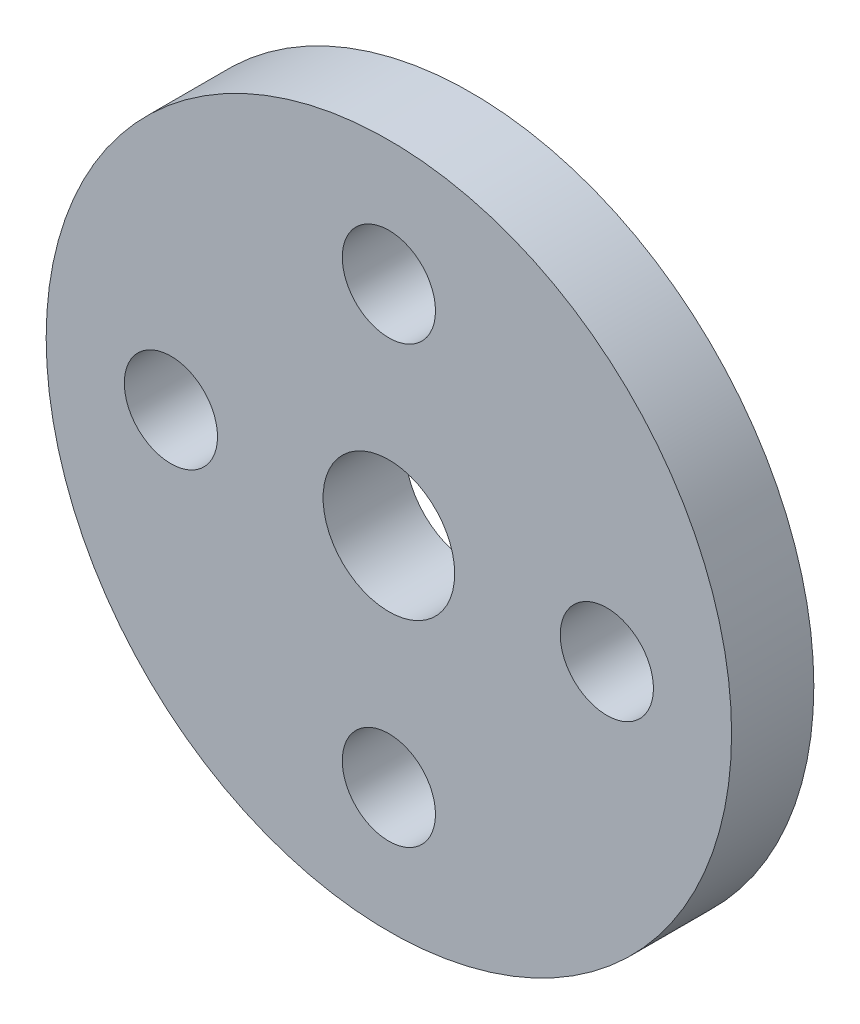
ISO-10303-21;
HEADER;
FILE_DESCRIPTION(('STEP AP214'),'2;1');
FILE_NAME('part.step','',(''),(''),'','','');
FILE_SCHEMA(('AUTOMOTIVE_DESIGN { 1 0 10303 214 1 1 1 1 }'));
ENDSEC;
DATA;
#1=APPLICATION_CONTEXT('core data for automotive mechanical design processes');
#2=APPLICATION_PROTOCOL_DEFINITION('international standard','automotive_design',2000,#1);
#3=PRODUCT_CONTEXT('',#1,'mechanical');
#4=PRODUCT('Part','Part','',(#3));
#5=PRODUCT_RELATED_PRODUCT_CATEGORY('part','',(#4));
#6=PRODUCT_DEFINITION_FORMATION('','',#4);
#7=PRODUCT_DEFINITION_CONTEXT('part definition',#1,'design');
#8=PRODUCT_DEFINITION('design','',#6,#7);
#9=PRODUCT_DEFINITION_SHAPE('','',#8);
#10=(LENGTH_UNIT() NAMED_UNIT(*) SI_UNIT(.MILLI.,.METRE.));
#11=(NAMED_UNIT(*) PLANE_ANGLE_UNIT() SI_UNIT($,.RADIAN.));
#12=(NAMED_UNIT(*) SI_UNIT($,.STERADIAN.) SOLID_ANGLE_UNIT());
#13=UNCERTAINTY_MEASURE_WITH_UNIT(LENGTH_MEASURE(1.E-05),#10,'distance_accuracy_value','');
#14=(GEOMETRIC_REPRESENTATION_CONTEXT(3) GLOBAL_UNCERTAINTY_ASSIGNED_CONTEXT((#13)) GLOBAL_UNIT_ASSIGNED_CONTEXT((#10,
#11,#12)) REPRESENTATION_CONTEXT('',''));
#15=CARTESIAN_POINT('',(0.,0.,0.));
#16=DIRECTION('',(0.,0.,1.));
#17=DIRECTION('',(1.,0.,0.));
#18=AXIS2_PLACEMENT_3D('',#15,#16,#17);
#19=CARTESIAN_POINT('',(0.,0.,3.));
#20=DIRECTION('',(0.,0.,1.));
#21=DIRECTION('',(1.,0.,0.));
#22=AXIS2_PLACEMENT_3D('',#19,#20,#21);
#23=PLANE('',#22);
#24=CARTESIAN_POINT('',(0.,-7.95,3.));
#25=DIRECTION('',(0.,0.,1.));
#26=DIRECTION('',(1.,0.,0.));
#27=AXIS2_PLACEMENT_3D('',#24,#25,#26);
#28=CIRCLE('',#27,1.69999999999999);
#29=CARTESIAN_POINT('',(1.69999999999999,-7.95,3.));
#30=VERTEX_POINT('',#29);
#31=EDGE_CURVE('E57',#30,#30,#28,.T.);
#32=ORIENTED_EDGE('',*,*,#31,.F.);
#33=EDGE_LOOP('',(#32));
#34=FACE_BOUND('',#33,.T.);
#35=CARTESIAN_POINT('',(0.,7.95,3.));
#36=DIRECTION('',(0.,0.,1.));
#37=DIRECTION('',(1.,0.,0.));
#38=AXIS2_PLACEMENT_3D('',#35,#36,#37);
#39=CIRCLE('',#38,1.69999999999999);
#40=CARTESIAN_POINT('',(1.69999999999999,7.95,3.));
#41=VERTEX_POINT('',#40);
#42=EDGE_CURVE('E45',#41,#41,#39,.T.);
#43=ORIENTED_EDGE('',*,*,#42,.F.);
#44=EDGE_LOOP('',(#43));
#45=FACE_BOUND('',#44,.T.);
#46=CARTESIAN_POINT('',(0.,0.,3.));
#47=DIRECTION('',(0.,0.,1.));
#48=DIRECTION('',(1.,0.,0.));
#49=AXIS2_PLACEMENT_3D('',#46,#47,#48);
#50=CIRCLE('',#49,12.5);
#51=CARTESIAN_POINT('',(12.5,0.,3.));
#52=VERTEX_POINT('',#51);
#53=EDGE_CURVE('E10',#52,#52,#50,.T.);
#54=ORIENTED_EDGE('',*,*,#53,.T.);
#55=EDGE_LOOP('',(#54));
#56=FACE_BOUND('',#55,.T.);
#57=CARTESIAN_POINT('',(0.,0.,3.));
#58=DIRECTION('',(0.,0.,1.));
#59=DIRECTION('',(1.,0.,0.));
#60=AXIS2_PLACEMENT_3D('',#57,#58,#59);
#61=CIRCLE('',#60,2.4);
#62=CARTESIAN_POINT('',(2.4,0.,3.));
#63=VERTEX_POINT('',#62);
#64=EDGE_CURVE('E40',#63,#63,#61,.T.);
#65=ORIENTED_EDGE('',*,*,#64,.F.);
#66=EDGE_LOOP('',(#65));
#67=FACE_BOUND('',#66,.T.);
#68=CARTESIAN_POINT('',(7.95,0.,3.));
#69=DIRECTION('',(0.,0.,1.));
#70=DIRECTION('',(1.,0.,0.));
#71=AXIS2_PLACEMENT_3D('',#68,#69,#70);
#72=CIRCLE('',#71,1.69999999999999);
#73=CARTESIAN_POINT('',(9.64999999999999,0.,3.));
#74=VERTEX_POINT('',#73);
#75=EDGE_CURVE('E51',#74,#74,#72,.T.);
#76=ORIENTED_EDGE('',*,*,#75,.F.);
#77=EDGE_LOOP('',(#76));
#78=FACE_BOUND('',#77,.T.);
#79=CARTESIAN_POINT('',(-7.95,0.,3.));
#80=DIRECTION('',(0.,0.,1.));
#81=DIRECTION('',(1.,0.,0.));
#82=AXIS2_PLACEMENT_3D('',#79,#80,#81);
#83=CIRCLE('',#82,1.69999999999999);
#84=CARTESIAN_POINT('',(-6.25000000000001,0.,3.));
#85=VERTEX_POINT('',#84);
#86=EDGE_CURVE('E63',#85,#85,#83,.T.);
#87=ORIENTED_EDGE('',*,*,#86,.F.);
#88=EDGE_LOOP('',(#87));
#89=FACE_BOUND('',#88,.T.);
#90=ADVANCED_FACE('F29',(#34,#45,#56,#67,#78,#89),#23,.T.);
#91=CARTESIAN_POINT('',(0.,0.,0.));
#92=DIRECTION('',(0.,0.,1.));
#93=DIRECTION('',(1.,0.,0.));
#94=AXIS2_PLACEMENT_3D('',#91,#92,#93);
#95=PLANE('',#94);
#96=CARTESIAN_POINT('',(0.,-7.95,0.));
#97=DIRECTION('',(0.,0.,1.));
#98=DIRECTION('',(1.,0.,0.));
#99=AXIS2_PLACEMENT_3D('',#96,#97,#98);
#100=CIRCLE('',#99,1.69999999999999);
#101=CARTESIAN_POINT('',(1.69999999999999,-7.95,0.));
#102=VERTEX_POINT('',#101);
#103=EDGE_CURVE('E60',#102,#102,#100,.T.);
#104=ORIENTED_EDGE('',*,*,#103,.T.);
#105=EDGE_LOOP('',(#104));
#106=FACE_BOUND('',#105,.T.);
#107=CARTESIAN_POINT('',(0.,7.95,0.));
#108=DIRECTION('',(0.,0.,1.));
#109=DIRECTION('',(1.,0.,0.));
#110=AXIS2_PLACEMENT_3D('',#107,#108,#109);
#111=CIRCLE('',#110,1.69999999999999);
#112=CARTESIAN_POINT('',(1.69999999999999,7.95,0.));
#113=VERTEX_POINT('',#112);
#114=EDGE_CURVE('E48',#113,#113,#111,.T.);
#115=ORIENTED_EDGE('',*,*,#114,.T.);
#116=EDGE_LOOP('',(#115));
#117=FACE_BOUND('',#116,.T.);
#118=CARTESIAN_POINT('',(0.,0.,0.));
#119=DIRECTION('',(0.,0.,1.));
#120=DIRECTION('',(1.,0.,0.));
#121=AXIS2_PLACEMENT_3D('',#118,#119,#120);
#122=CIRCLE('',#121,12.5);
#123=CARTESIAN_POINT('',(12.5,0.,0.));
#124=VERTEX_POINT('',#123);
#125=EDGE_CURVE('E33',#124,#124,#122,.T.);
#126=ORIENTED_EDGE('',*,*,#125,.F.);
#127=EDGE_LOOP('',(#126));
#128=FACE_BOUND('',#127,.T.);
#129=CARTESIAN_POINT('',(0.,0.,0.));
#130=DIRECTION('',(0.,0.,1.));
#131=DIRECTION('',(1.,0.,0.));
#132=AXIS2_PLACEMENT_3D('',#129,#130,#131);
#133=CIRCLE('',#132,2.4);
#134=CARTESIAN_POINT('',(2.4,0.,0.));
#135=VERTEX_POINT('',#134);
#136=EDGE_CURVE('E42',#135,#135,#133,.T.);
#137=ORIENTED_EDGE('',*,*,#136,.T.);
#138=EDGE_LOOP('',(#137));
#139=FACE_BOUND('',#138,.T.);
#140=CARTESIAN_POINT('',(7.95,0.,0.));
#141=DIRECTION('',(0.,0.,1.));
#142=DIRECTION('',(1.,0.,0.));
#143=AXIS2_PLACEMENT_3D('',#140,#141,#142);
#144=CIRCLE('',#143,1.69999999999999);
#145=CARTESIAN_POINT('',(9.64999999999999,0.,0.));
#146=VERTEX_POINT('',#145);
#147=EDGE_CURVE('E54',#146,#146,#144,.T.);
#148=ORIENTED_EDGE('',*,*,#147,.T.);
#149=EDGE_LOOP('',(#148));
#150=FACE_BOUND('',#149,.T.);
#151=CARTESIAN_POINT('',(-7.95,0.,0.));
#152=DIRECTION('',(0.,0.,1.));
#153=DIRECTION('',(1.,0.,0.));
#154=AXIS2_PLACEMENT_3D('',#151,#152,#153);
#155=CIRCLE('',#154,1.69999999999999);
#156=CARTESIAN_POINT('',(-6.25000000000001,0.,0.));
#157=VERTEX_POINT('',#156);
#158=EDGE_CURVE('E66',#157,#157,#155,.T.);
#159=ORIENTED_EDGE('',*,*,#158,.T.);
#160=EDGE_LOOP('',(#159));
#161=FACE_BOUND('',#160,.T.);
#162=ADVANCED_FACE('F76',(#106,#117,#128,#139,#150,#161),#95,.F.);
#163=CARTESIAN_POINT('',(0.,0.,3.));
#164=DIRECTION('',(0.,0.,-1.));
#165=DIRECTION('',(-1.,0.,0.));
#166=AXIS2_PLACEMENT_3D('',#163,#164,#165);
#167=CYLINDRICAL_SURFACE('',#166,12.5);
#168=ORIENTED_EDGE('',*,*,#53,.F.);
#169=EDGE_LOOP('',(#168));
#170=FACE_BOUND('',#169,.T.);
#171=ORIENTED_EDGE('',*,*,#125,.T.);
#172=EDGE_LOOP('',(#171));
#173=FACE_BOUND('',#172,.T.);
#174=ADVANCED_FACE('F31',(#170,#173),#167,.T.);
#175=CARTESIAN_POINT('',(0.,0.,3.));
#176=DIRECTION('',(0.,0.,-1.));
#177=DIRECTION('',(-1.,0.,0.));
#178=AXIS2_PLACEMENT_3D('',#175,#176,#177);
#179=CYLINDRICAL_SURFACE('',#178,2.4);
#180=ORIENTED_EDGE('',*,*,#64,.T.);
#181=EDGE_LOOP('',(#180));
#182=FACE_BOUND('',#181,.T.);
#183=ORIENTED_EDGE('',*,*,#136,.F.);
#184=EDGE_LOOP('',(#183));
#185=FACE_BOUND('',#184,.T.);
#186=ADVANCED_FACE('F86',(#182,#185),#179,.F.);
#187=CARTESIAN_POINT('',(0.,7.95,3.));
#188=DIRECTION('',(0.,0.,-1.));
#189=DIRECTION('',(-1.,0.,0.));
#190=AXIS2_PLACEMENT_3D('',#187,#188,#189);
#191=CYLINDRICAL_SURFACE('',#190,1.69999999999999);
#192=ORIENTED_EDGE('',*,*,#42,.T.);
#193=EDGE_LOOP('',(#192));
#194=FACE_BOUND('',#193,.T.);
#195=ORIENTED_EDGE('',*,*,#114,.F.);
#196=EDGE_LOOP('',(#195));
#197=FACE_BOUND('',#196,.T.);
#198=ADVANCED_FACE('F89',(#194,#197),#191,.F.);
#199=CARTESIAN_POINT('',(7.95,0.,3.));
#200=DIRECTION('',(0.,0.,-1.));
#201=DIRECTION('',(-1.,0.,0.));
#202=AXIS2_PLACEMENT_3D('',#199,#200,#201);
#203=CYLINDRICAL_SURFACE('',#202,1.69999999999999);
#204=ORIENTED_EDGE('',*,*,#75,.T.);
#205=EDGE_LOOP('',(#204));
#206=FACE_BOUND('',#205,.T.);
#207=ORIENTED_EDGE('',*,*,#147,.F.);
#208=EDGE_LOOP('',(#207));
#209=FACE_BOUND('',#208,.T.);
#210=ADVANCED_FACE('F93',(#206,#209),#203,.F.);
#211=CARTESIAN_POINT('',(0.,-7.95,3.));
#212=DIRECTION('',(0.,0.,-1.));
#213=DIRECTION('',(-1.,0.,0.));
#214=AXIS2_PLACEMENT_3D('',#211,#212,#213);
#215=CYLINDRICAL_SURFACE('',#214,1.69999999999999);
#216=ORIENTED_EDGE('',*,*,#31,.T.);
#217=EDGE_LOOP('',(#216));
#218=FACE_BOUND('',#217,.T.);
#219=ORIENTED_EDGE('',*,*,#103,.F.);
#220=EDGE_LOOP('',(#219));
#221=FACE_BOUND('',#220,.T.);
#222=ADVANCED_FACE('F97',(#218,#221),#215,.F.);
#223=CARTESIAN_POINT('',(-7.95,0.,3.));
#224=DIRECTION('',(0.,0.,-1.));
#225=DIRECTION('',(-1.,0.,0.));
#226=AXIS2_PLACEMENT_3D('',#223,#224,#225);
#227=CYLINDRICAL_SURFACE('',#226,1.69999999999999);
#228=ORIENTED_EDGE('',*,*,#86,.T.);
#229=EDGE_LOOP('',(#228));
#230=FACE_BOUND('',#229,.T.);
#231=ORIENTED_EDGE('',*,*,#158,.F.);
#232=EDGE_LOOP('',(#231));
#233=FACE_BOUND('',#232,.T.);
#234=ADVANCED_FACE('F72',(#230,#233),#227,.F.);
#235=CLOSED_SHELL('',(#90,#162,#174,#186,#198,#210,#222,#234));
#236=MANIFOLD_SOLID_BREP('B2',#235);
#237=ADVANCED_BREP_SHAPE_REPRESENTATION('',(#18,#236),#14);
#238=SHAPE_DEFINITION_REPRESENTATION(#9,#237);
ENDSEC;
END-ISO-10303-21;
